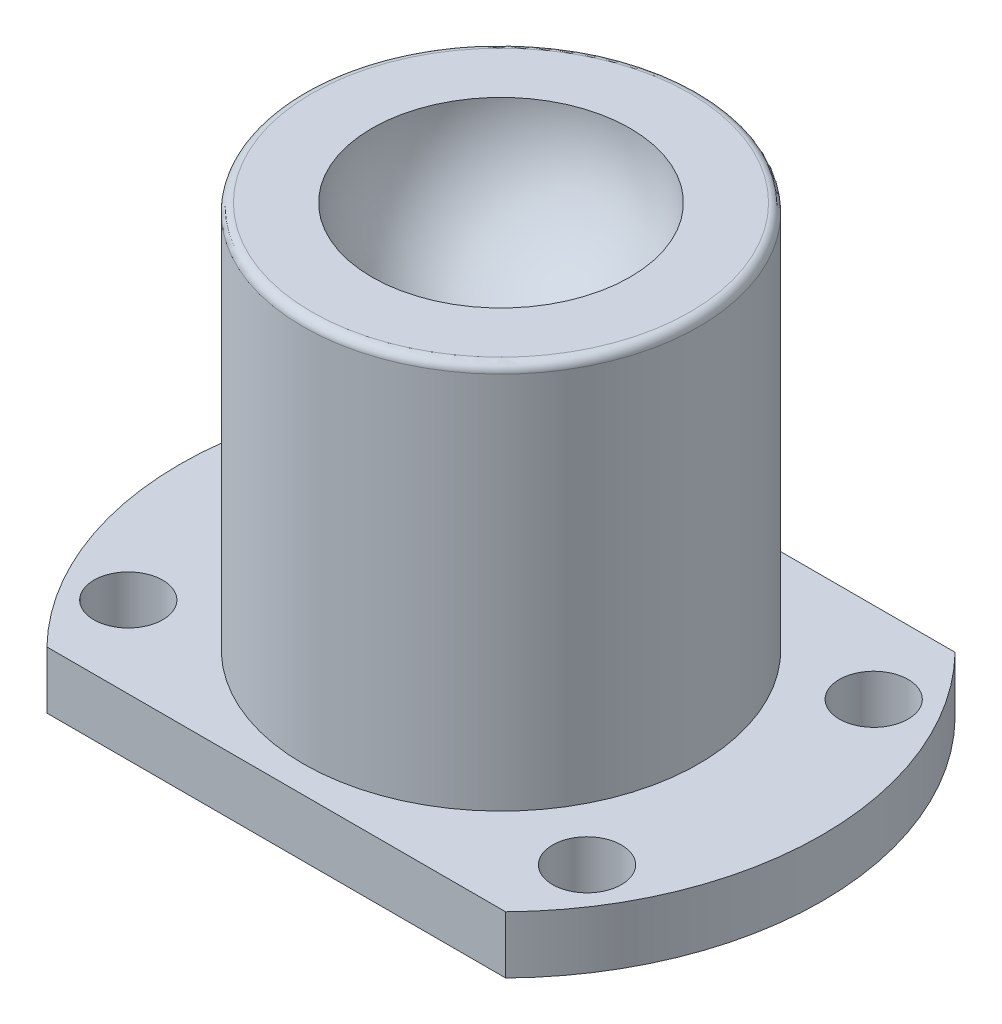
ISO-10303-21;
HEADER;
FILE_DESCRIPTION(('STEP AP214'),'2;1');
FILE_NAME('part.step','',(''),(''),'','','');
FILE_SCHEMA(('AUTOMOTIVE_DESIGN { 1 0 10303 214 1 1 1 1 }'));
ENDSEC;
DATA;
#1=APPLICATION_CONTEXT('core data for automotive mechanical design processes');
#2=APPLICATION_PROTOCOL_DEFINITION('international standard','automotive_design',2000,#1);
#3=PRODUCT_CONTEXT('',#1,'mechanical');
#4=PRODUCT('Part','Part','',(#3));
#5=PRODUCT_RELATED_PRODUCT_CATEGORY('part','',(#4));
#6=PRODUCT_DEFINITION_FORMATION('','',#4);
#7=PRODUCT_DEFINITION_CONTEXT('part definition',#1,'design');
#8=PRODUCT_DEFINITION('design','',#6,#7);
#9=PRODUCT_DEFINITION_SHAPE('','',#8);
#10=(LENGTH_UNIT() NAMED_UNIT(*) SI_UNIT(.MILLI.,.METRE.));
#11=(NAMED_UNIT(*) PLANE_ANGLE_UNIT() SI_UNIT($,.RADIAN.));
#12=(NAMED_UNIT(*) SI_UNIT($,.STERADIAN.) SOLID_ANGLE_UNIT());
#13=UNCERTAINTY_MEASURE_WITH_UNIT(LENGTH_MEASURE(1.E-05),#10,'distance_accuracy_value','');
#14=(GEOMETRIC_REPRESENTATION_CONTEXT(3) GLOBAL_UNCERTAINTY_ASSIGNED_CONTEXT((#13)) GLOBAL_UNIT_ASSIGNED_CONTEXT((#10,
#11,#12)) REPRESENTATION_CONTEXT('',''));
#15=CARTESIAN_POINT('',(0.,0.,0.));
#16=DIRECTION('',(0.,0.,1.));
#17=DIRECTION('',(1.,0.,0.));
#18=AXIS2_PLACEMENT_3D('',#15,#16,#17);
#19=CARTESIAN_POINT('',(0.,2.,0.));
#20=DIRECTION('',(0.,-1.,0.));
#21=DIRECTION('',(0.,0.,-1.));
#22=AXIS2_PLACEMENT_3D('',#19,#20,#21);
#23=CYLINDRICAL_SURFACE('',#22,11.2);
#24=DIRECTION('',(0.,1.,0.));
#25=VECTOR('',#24,1.);
#26=CARTESIAN_POINT('',(-8.00000000000001,0.,7.83836717690617));
#27=LINE('',#26,#25);
#28=CARTESIAN_POINT('',(-8.00000000000001,0.,7.83836717690617));
#29=VERTEX_POINT('',#28);
#30=CARTESIAN_POINT('',(-8.00000000000001,2.,7.83836717690617));
#31=VERTEX_POINT('',#30);
#32=EDGE_CURVE('E57',#29,#31,#27,.T.);
#33=ORIENTED_EDGE('',*,*,#32,.T.);
#34=CARTESIAN_POINT('',(0.,2.,0.));
#35=DIRECTION('',(0.,1.,0.));
#36=DIRECTION('',(0.,0.,1.));
#37=AXIS2_PLACEMENT_3D('',#34,#35,#36);
#38=CIRCLE('',#37,11.2);
#39=CARTESIAN_POINT('',(-8.,2.,-7.83836717690617));
#40=VERTEX_POINT('',#39);
#41=EDGE_CURVE('E101',#40,#31,#38,.T.);
#42=ORIENTED_EDGE('',*,*,#41,.F.);
#43=DIRECTION('',(0.,1.,0.));
#44=VECTOR('',#43,1.);
#45=CARTESIAN_POINT('',(-8.,0.,-7.83836717690617));
#46=LINE('',#45,#44);
#47=CARTESIAN_POINT('',(-8.,0.,-7.83836717690617));
#48=VERTEX_POINT('',#47);
#49=EDGE_CURVE('E138',#48,#40,#46,.T.);
#50=ORIENTED_EDGE('',*,*,#49,.F.);
#51=CARTESIAN_POINT('',(0.,0.,0.));
#52=DIRECTION('',(0.,1.,0.));
#53=DIRECTION('',(0.,0.,1.));
#54=AXIS2_PLACEMENT_3D('',#51,#52,#53);
#55=CIRCLE('',#54,11.2);
#56=EDGE_CURVE('E98',#48,#29,#55,.T.);
#57=ORIENTED_EDGE('',*,*,#56,.T.);
#58=EDGE_LOOP('',(#33,#42,#50,#57));
#59=FACE_BOUND('',#58,.T.);
#60=ADVANCED_FACE('F41',(#59),#23,.T.);
#61=DIRECTION('',(0.,1.,0.));
#62=VECTOR('',#61,1.);
#63=CARTESIAN_POINT('',(8.,0.,7.83836717690617));
#64=LINE('',#63,#62);
#65=CARTESIAN_POINT('',(8.,0.,7.83836717690617));
#66=VERTEX_POINT('',#65);
#67=CARTESIAN_POINT('',(8.,2.,7.83836717690617));
#68=VERTEX_POINT('',#67);
#69=EDGE_CURVE('E83',#66,#68,#64,.T.);
#70=ORIENTED_EDGE('',*,*,#69,.F.);
#71=CARTESIAN_POINT('',(8.,0.,-7.83836717690617));
#72=VERTEX_POINT('',#71);
#73=EDGE_CURVE('E95',#66,#72,#55,.T.);
#74=ORIENTED_EDGE('',*,*,#73,.T.);
#75=DIRECTION('',(0.,1.,0.));
#76=VECTOR('',#75,1.);
#77=CARTESIAN_POINT('',(8.,0.,-7.83836717690617));
#78=LINE('',#77,#76);
#79=CARTESIAN_POINT('',(8.,2.,-7.83836717690617));
#80=VERTEX_POINT('',#79);
#81=EDGE_CURVE('E65',#72,#80,#78,.T.);
#82=ORIENTED_EDGE('',*,*,#81,.T.);
#83=EDGE_CURVE('E97',#68,#80,#38,.T.);
#84=ORIENTED_EDGE('',*,*,#83,.F.);
#85=EDGE_LOOP('',(#70,#74,#82,#84));
#86=FACE_BOUND('',#85,.T.);
#87=ADVANCED_FACE('F94',(#86),#23,.T.);
#88=CARTESIAN_POINT('',(0.,2.,0.));
#89=DIRECTION('',(0.,1.,0.));
#90=DIRECTION('',(0.,0.,1.));
#91=AXIS2_PLACEMENT_3D('',#88,#89,#90);
#92=PLANE('',#91);
#93=CARTESIAN_POINT('',(8.,2.,-5.));
#94=DIRECTION('',(0.,1.,0.));
#95=DIRECTION('',(0.,0.,1.));
#96=AXIS2_PLACEMENT_3D('',#93,#94,#95);
#97=CIRCLE('',#96,1.2);
#98=CARTESIAN_POINT('',(8.,2.,-3.8));
#99=VERTEX_POINT('',#98);
#100=EDGE_CURVE('E167',#99,#99,#97,.T.);
#101=ORIENTED_EDGE('',*,*,#100,.F.);
#102=EDGE_LOOP('',(#101));
#103=FACE_BOUND('',#102,.T.);
#104=CARTESIAN_POINT('',(8.,2.,5.));
#105=DIRECTION('',(0.,1.,0.));
#106=DIRECTION('',(0.,0.,1.));
#107=AXIS2_PLACEMENT_3D('',#104,#105,#106);
#108=CIRCLE('',#107,1.2);
#109=CARTESIAN_POINT('',(8.,2.,6.2));
#110=VERTEX_POINT('',#109);
#111=EDGE_CURVE('E171',#110,#110,#108,.T.);
#112=ORIENTED_EDGE('',*,*,#111,.F.);
#113=EDGE_LOOP('',(#112));
#114=FACE_BOUND('',#113,.T.);
#115=CARTESIAN_POINT('',(-8.,2.,5.));
#116=DIRECTION('',(0.,1.,0.));
#117=DIRECTION('',(0.,0.,1.));
#118=AXIS2_PLACEMENT_3D('',#115,#116,#117);
#119=CIRCLE('',#118,1.2);
#120=CARTESIAN_POINT('',(-8.,2.,6.2));
#121=VERTEX_POINT('',#120);
#122=EDGE_CURVE('E175',#121,#121,#119,.T.);
#123=ORIENTED_EDGE('',*,*,#122,.F.);
#124=EDGE_LOOP('',(#123));
#125=FACE_BOUND('',#124,.T.);
#126=CARTESIAN_POINT('',(-8.,2.,-5.));
#127=DIRECTION('',(0.,1.,0.));
#128=DIRECTION('',(0.,0.,1.));
#129=AXIS2_PLACEMENT_3D('',#126,#127,#128);
#130=CIRCLE('',#129,1.2);
#131=CARTESIAN_POINT('',(-8.,2.,-3.8));
#132=VERTEX_POINT('',#131);
#133=EDGE_CURVE('E111',#132,#132,#130,.T.);
#134=ORIENTED_EDGE('',*,*,#133,.F.);
#135=EDGE_LOOP('',(#134));
#136=FACE_BOUND('',#135,.T.);
#137=CARTESIAN_POINT('',(0.,2.,0.));
#138=DIRECTION('',(0.,1.,0.));
#139=DIRECTION('',(0.,0.,1.));
#140=AXIS2_PLACEMENT_3D('',#137,#138,#139);
#141=CIRCLE('',#140,6.9);
#142=CARTESIAN_POINT('',(0.,2.,6.9));
#143=VERTEX_POINT('',#142);
#144=EDGE_CURVE('E122',#143,#143,#141,.T.);
#145=ORIENTED_EDGE('',*,*,#144,.F.);
#146=EDGE_LOOP('',(#145));
#147=FACE_BOUND('',#146,.T.);
#148=ORIENTED_EDGE('',*,*,#41,.T.);
#149=DIRECTION('',(1.,0.,0.));
#150=VECTOR('',#149,1.);
#151=CARTESIAN_POINT('',(-8.,2.,7.83836717690617));
#152=LINE('',#151,#150);
#153=EDGE_CURVE('E132',#31,#68,#152,.T.);
#154=ORIENTED_EDGE('',*,*,#153,.T.);
#155=ORIENTED_EDGE('',*,*,#83,.T.);
#156=DIRECTION('',(-1.,0.,0.));
#157=VECTOR('',#156,1.);
#158=CARTESIAN_POINT('',(-8.,2.,-7.83836717690617));
#159=LINE('',#158,#157);
#160=EDGE_CURVE('E120',#80,#40,#159,.T.);
#161=ORIENTED_EDGE('',*,*,#160,.T.);
#162=EDGE_LOOP('',(#148,#154,#155,#161));
#163=FACE_BOUND('',#162,.T.);
#164=ADVANCED_FACE('F140',(#103,#114,#125,#136,#147,#163),#92,.T.);
#165=CARTESIAN_POINT('',(0.,0.,0.));
#166=DIRECTION('',(0.,1.,0.));
#167=DIRECTION('',(0.,0.,1.));
#168=AXIS2_PLACEMENT_3D('',#165,#166,#167);
#169=PLANE('',#168);
#170=CARTESIAN_POINT('',(8.,0.,-5.));
#171=DIRECTION('',(0.,1.,0.));
#172=DIRECTION('',(0.,0.,1.));
#173=AXIS2_PLACEMENT_3D('',#170,#171,#172);
#174=CIRCLE('',#173,1.2);
#175=CARTESIAN_POINT('',(8.,0.,-3.8));
#176=VERTEX_POINT('',#175);
#177=EDGE_CURVE('E117',#176,#176,#174,.T.);
#178=ORIENTED_EDGE('',*,*,#177,.T.);
#179=EDGE_LOOP('',(#178));
#180=FACE_BOUND('',#179,.T.);
#181=CARTESIAN_POINT('',(8.,0.,5.));
#182=DIRECTION('',(0.,1.,0.));
#183=DIRECTION('',(0.,0.,1.));
#184=AXIS2_PLACEMENT_3D('',#181,#182,#183);
#185=CIRCLE('',#184,1.2);
#186=CARTESIAN_POINT('',(8.,0.,6.2));
#187=VERTEX_POINT('',#186);
#188=EDGE_CURVE('E114',#187,#187,#185,.T.);
#189=ORIENTED_EDGE('',*,*,#188,.T.);
#190=EDGE_LOOP('',(#189));
#191=FACE_BOUND('',#190,.T.);
#192=CARTESIAN_POINT('',(-8.,0.,5.));
#193=DIRECTION('',(0.,1.,0.));
#194=DIRECTION('',(0.,0.,1.));
#195=AXIS2_PLACEMENT_3D('',#192,#193,#194);
#196=CIRCLE('',#195,1.2);
#197=CARTESIAN_POINT('',(-8.,0.,6.2));
#198=VERTEX_POINT('',#197);
#199=EDGE_CURVE('E110',#198,#198,#196,.T.);
#200=ORIENTED_EDGE('',*,*,#199,.T.);
#201=EDGE_LOOP('',(#200));
#202=FACE_BOUND('',#201,.T.);
#203=CARTESIAN_POINT('',(-8.,0.,-5.));
#204=DIRECTION('',(0.,1.,0.));
#205=DIRECTION('',(0.,0.,1.));
#206=AXIS2_PLACEMENT_3D('',#203,#204,#205);
#207=CIRCLE('',#206,1.2);
#208=CARTESIAN_POINT('',(-8.,0.,-3.8));
#209=VERTEX_POINT('',#208);
#210=EDGE_CURVE('E107',#209,#209,#207,.T.);
#211=ORIENTED_EDGE('',*,*,#210,.T.);
#212=EDGE_LOOP('',(#211));
#213=FACE_BOUND('',#212,.T.);
#214=DIRECTION('',(1.,0.,0.));
#215=VECTOR('',#214,1.);
#216=CARTESIAN_POINT('',(-8.,0.,7.83836717690617));
#217=LINE('',#216,#215);
#218=EDGE_CURVE('E80',#29,#66,#217,.T.);
#219=ORIENTED_EDGE('',*,*,#218,.F.);
#220=ORIENTED_EDGE('',*,*,#56,.F.);
#221=DIRECTION('',(-1.,0.,0.));
#222=VECTOR('',#221,1.);
#223=CARTESIAN_POINT('',(-8.,0.,-7.83836717690617));
#224=LINE('',#223,#222);
#225=EDGE_CURVE('E89',#72,#48,#224,.T.);
#226=ORIENTED_EDGE('',*,*,#225,.F.);
#227=ORIENTED_EDGE('',*,*,#73,.F.);
#228=EDGE_LOOP('',(#219,#220,#226,#227));
#229=FACE_BOUND('',#228,.T.);
#230=ADVANCED_FACE('F100',(#180,#191,#202,#213,#229),#169,.F.);
#231=CARTESIAN_POINT('',(-8.,0.,-7.83836717690617));
#232=DIRECTION('',(0.,0.,-1.));
#233=DIRECTION('',(-1.,0.,0.));
#234=AXIS2_PLACEMENT_3D('',#231,#232,#233);
#235=PLANE('',#234);
#236=ORIENTED_EDGE('',*,*,#160,.F.);
#237=ORIENTED_EDGE('',*,*,#81,.F.);
#238=ORIENTED_EDGE('',*,*,#225,.T.);
#239=ORIENTED_EDGE('',*,*,#49,.T.);
#240=EDGE_LOOP('',(#236,#237,#238,#239));
#241=FACE_BOUND('',#240,.T.);
#242=ADVANCED_FACE('F144',(#241),#235,.T.);
#243=CARTESIAN_POINT('',(-8.,0.,7.83836717690617));
#244=DIRECTION('',(0.,0.,1.));
#245=DIRECTION('',(1.,0.,0.));
#246=AXIS2_PLACEMENT_3D('',#243,#244,#245);
#247=PLANE('',#246);
#248=ORIENTED_EDGE('',*,*,#153,.F.);
#249=ORIENTED_EDGE('',*,*,#32,.F.);
#250=ORIENTED_EDGE('',*,*,#218,.T.);
#251=ORIENTED_EDGE('',*,*,#69,.T.);
#252=EDGE_LOOP('',(#248,#249,#250,#251));
#253=FACE_BOUND('',#252,.T.);
#254=ADVANCED_FACE('F82',(#253),#247,.T.);
#255=CARTESIAN_POINT('',(0.,15.5,0.));
#256=DIRECTION('',(0.,-1.,0.));
#257=DIRECTION('',(0.,0.,-1.));
#258=AXIS2_PLACEMENT_3D('',#255,#256,#257);
#259=CYLINDRICAL_SURFACE('',#258,6.9);
#260=CARTESIAN_POINT('',(0.,15.2,0.));
#261=DIRECTION('',(0.,1.,0.));
#262=DIRECTION('',(0.,0.,1.));
#263=AXIS2_PLACEMENT_3D('',#260,#261,#262);
#264=CIRCLE('',#263,6.9);
#265=CARTESIAN_POINT('',(0.,15.2,6.9));
#266=VERTEX_POINT('',#265);
#267=EDGE_CURVE('E12',#266,#266,#264,.F.);
#268=ORIENTED_EDGE('',*,*,#267,.T.);
#269=EDGE_LOOP('',(#268));
#270=FACE_BOUND('',#269,.T.);
#271=ORIENTED_EDGE('',*,*,#144,.T.);
#272=EDGE_LOOP('',(#271));
#273=FACE_BOUND('',#272,.T.);
#274=ADVANCED_FACE('F151',(#270,#273),#259,.T.);
#275=CARTESIAN_POINT('',(0.,15.5,0.));
#276=DIRECTION('',(0.,1.,0.));
#277=DIRECTION('',(0.,0.,1.));
#278=AXIS2_PLACEMENT_3D('',#275,#276,#277);
#279=PLANE('',#278);
#280=CARTESIAN_POINT('',(0.,15.5,0.));
#281=DIRECTION('',(0.,1.,0.));
#282=DIRECTION('',(0.,0.,1.));
#283=AXIS2_PLACEMENT_3D('',#280,#281,#282);
#284=CIRCLE('',#283,4.5);
#285=CARTESIAN_POINT('',(0.,15.5,4.5));
#286=VERTEX_POINT('',#285);
#287=EDGE_CURVE('E45',#286,#286,#284,.T.);
#288=ORIENTED_EDGE('',*,*,#287,.F.);
#289=EDGE_LOOP('',(#288));
#290=FACE_BOUND('',#289,.T.);
#291=CARTESIAN_POINT('',(0.,15.5,0.));
#292=DIRECTION('',(0.,1.,0.));
#293=DIRECTION('',(0.,0.,1.));
#294=AXIS2_PLACEMENT_3D('',#291,#292,#293);
#295=CIRCLE('',#294,6.6);
#296=CARTESIAN_POINT('',(0.,15.5,6.6));
#297=VERTEX_POINT('',#296);
#298=EDGE_CURVE('E50',#297,#297,#295,.T.);
#299=ORIENTED_EDGE('',*,*,#298,.T.);
#300=EDGE_LOOP('',(#299));
#301=FACE_BOUND('',#300,.T.);
#302=ADVANCED_FACE('F189',(#290,#301),#279,.T.);
#303=CARTESIAN_POINT('',(-8.,-11.5,-5.));
#304=DIRECTION('',(0.,1.,0.));
#305=DIRECTION('',(0.,0.,1.));
#306=AXIS2_PLACEMENT_3D('',#303,#304,#305);
#307=CYLINDRICAL_SURFACE('',#306,1.2);
#308=ORIENTED_EDGE('',*,*,#133,.T.);
#309=EDGE_LOOP('',(#308));
#310=FACE_BOUND('',#309,.T.);
#311=ORIENTED_EDGE('',*,*,#210,.F.);
#312=EDGE_LOOP('',(#311));
#313=FACE_BOUND('',#312,.T.);
#314=ADVANCED_FACE('F191',(#310,#313),#307,.F.);
#315=CARTESIAN_POINT('',(-8.,-11.5,5.));
#316=DIRECTION('',(0.,1.,0.));
#317=DIRECTION('',(0.,0.,1.));
#318=AXIS2_PLACEMENT_3D('',#315,#316,#317);
#319=CYLINDRICAL_SURFACE('',#318,1.2);
#320=ORIENTED_EDGE('',*,*,#122,.T.);
#321=EDGE_LOOP('',(#320));
#322=FACE_BOUND('',#321,.T.);
#323=ORIENTED_EDGE('',*,*,#199,.F.);
#324=EDGE_LOOP('',(#323));
#325=FACE_BOUND('',#324,.T.);
#326=ADVANCED_FACE('F197',(#322,#325),#319,.F.);
#327=CARTESIAN_POINT('',(8.,-11.5,5.));
#328=DIRECTION('',(0.,1.,0.));
#329=DIRECTION('',(0.,0.,1.));
#330=AXIS2_PLACEMENT_3D('',#327,#328,#329);
#331=CYLINDRICAL_SURFACE('',#330,1.2);
#332=ORIENTED_EDGE('',*,*,#111,.T.);
#333=EDGE_LOOP('',(#332));
#334=FACE_BOUND('',#333,.T.);
#335=ORIENTED_EDGE('',*,*,#188,.F.);
#336=EDGE_LOOP('',(#335));
#337=FACE_BOUND('',#336,.T.);
#338=ADVANCED_FACE('F205',(#334,#337),#331,.F.);
#339=CARTESIAN_POINT('',(8.,-11.5,-5.));
#340=DIRECTION('',(0.,1.,0.));
#341=DIRECTION('',(0.,0.,1.));
#342=AXIS2_PLACEMENT_3D('',#339,#340,#341);
#343=CYLINDRICAL_SURFACE('',#342,1.2);
#344=ORIENTED_EDGE('',*,*,#100,.T.);
#345=EDGE_LOOP('',(#344));
#346=FACE_BOUND('',#345,.T.);
#347=ORIENTED_EDGE('',*,*,#177,.F.);
#348=EDGE_LOOP('',(#347));
#349=FACE_BOUND('',#348,.T.);
#350=ADVANCED_FACE('F202',(#346,#349),#343,.F.);
#351=CARTESIAN_POINT('',(0.,15.2,0.));
#352=DIRECTION('',(0.,1.,0.));
#353=DIRECTION('',(0.,0.,1.));
#354=AXIS2_PLACEMENT_3D('',#351,#352,#353);
#355=TOROIDAL_SURFACE('',#354,6.6,0.3);
#356=ORIENTED_EDGE('',*,*,#267,.F.);
#357=EDGE_LOOP('',(#356));
#358=FACE_BOUND('',#357,.T.);
#359=ORIENTED_EDGE('',*,*,#298,.F.);
#360=EDGE_LOOP('',(#359));
#361=FACE_BOUND('',#360,.T.);
#362=ADVANCED_FACE('F43',(#358,#361),#355,.T.);
#363=CARTESIAN_POINT('',(0.,15.5,0.));
#364=DIRECTION('',(0.,0.,1.));
#365=DIRECTION('',(1.,0.,0.));
#366=AXIS2_PLACEMENT_3D('',#363,#364,#365);
#367=SPHERICAL_SURFACE('',#366,4.5);
#368=CARTESIAN_POINT('',(0.,15.5,0.));
#369=DIRECTION('',(0.,1.,0.));
#370=DIRECTION('',(0.,0.,1.));
#371=AXIS2_PLACEMENT_3D('',#368,#369,#370);
#372=SPHERICAL_SURFACE('',#371,4.5);
#373=ORIENTED_EDGE('',*,*,#287,.T.);
#374=EDGE_LOOP('',(#373));
#375=FACE_BOUND('',#374,.T.);
#376=ADVANCED_FACE('F187',(#375),#372,.F.);
#377=CLOSED_SHELL('',(#60,#87,#164,#230,#242,#254,#274,#302,#314,#326,#338,#350,#362,#376));
#378=MANIFOLD_SOLID_BREP('B2',#377);
#379=ADVANCED_BREP_SHAPE_REPRESENTATION('',(#18,#378),#14);
#380=SHAPE_DEFINITION_REPRESENTATION(#9,#379);
ENDSEC;
END-ISO-10303-21;
